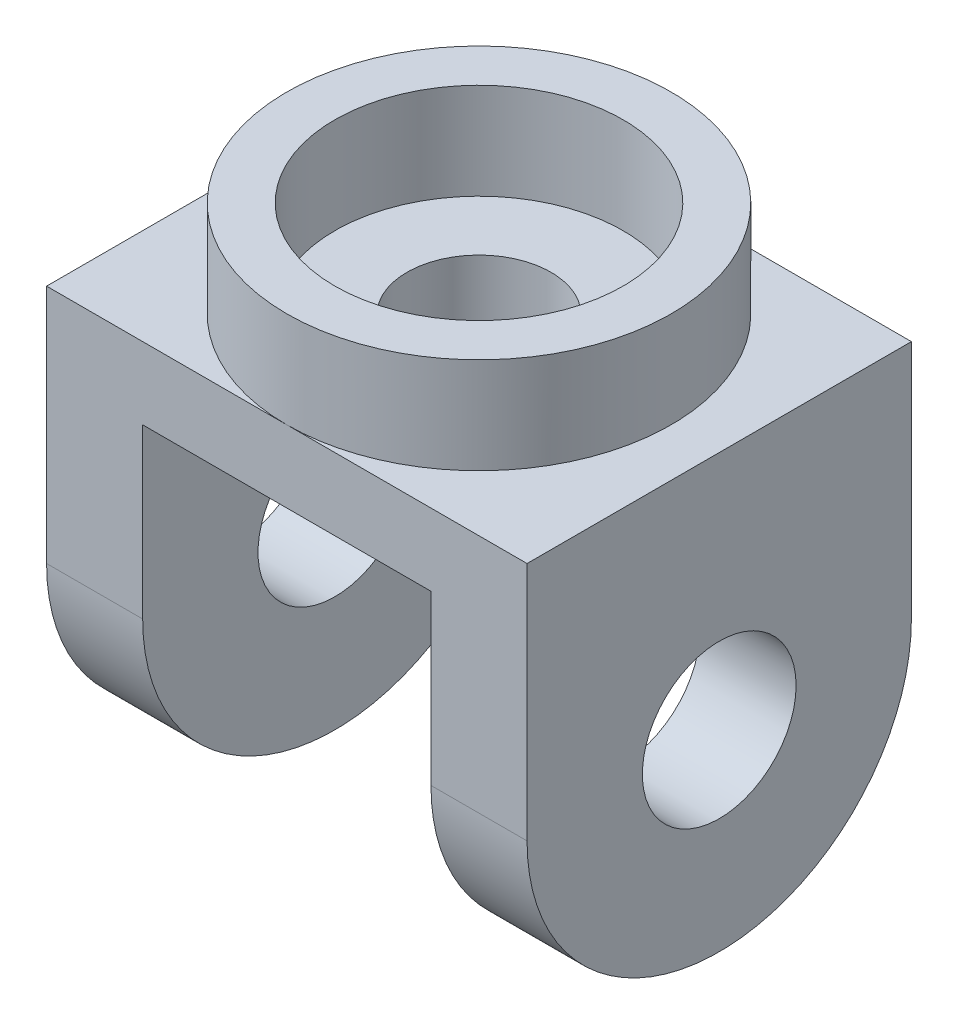
ISO-10303-21;
HEADER;
FILE_DESCRIPTION(('STEP AP214'),'2;1');
FILE_NAME('part.step','',(''),(''),'','','');
FILE_SCHEMA(('AUTOMOTIVE_DESIGN { 1 0 10303 214 1 1 1 1 }'));
ENDSEC;
DATA;
#1=APPLICATION_CONTEXT('core data for automotive mechanical design processes');
#2=APPLICATION_PROTOCOL_DEFINITION('international standard','automotive_design',2000,#1);
#3=PRODUCT_CONTEXT('',#1,'mechanical');
#4=PRODUCT('Part','Part','',(#3));
#5=PRODUCT_RELATED_PRODUCT_CATEGORY('part','',(#4));
#6=PRODUCT_DEFINITION_FORMATION('','',#4);
#7=PRODUCT_DEFINITION_CONTEXT('part definition',#1,'design');
#8=PRODUCT_DEFINITION('design','',#6,#7);
#9=PRODUCT_DEFINITION_SHAPE('','',#8);
#10=(LENGTH_UNIT() NAMED_UNIT(*) SI_UNIT(.MILLI.,.METRE.));
#11=(NAMED_UNIT(*) PLANE_ANGLE_UNIT() SI_UNIT($,.RADIAN.));
#12=(NAMED_UNIT(*) SI_UNIT($,.STERADIAN.) SOLID_ANGLE_UNIT());
#13=UNCERTAINTY_MEASURE_WITH_UNIT(LENGTH_MEASURE(1.E-05),#10,'distance_accuracy_value','');
#14=(GEOMETRIC_REPRESENTATION_CONTEXT(3) GLOBAL_UNCERTAINTY_ASSIGNED_CONTEXT((#13)) GLOBAL_UNIT_ASSIGNED_CONTEXT((#10,
#11,#12)) REPRESENTATION_CONTEXT('',''));
#15=CARTESIAN_POINT('',(0.,0.,0.));
#16=DIRECTION('',(0.,0.,1.));
#17=DIRECTION('',(1.,0.,0.));
#18=AXIS2_PLACEMENT_3D('',#15,#16,#17);
#19=CARTESIAN_POINT('',(-50.,25.,-80.));
#20=DIRECTION('',(0.,1.,0.));
#21=DIRECTION('',(0.,0.,1.));
#22=AXIS2_PLACEMENT_3D('',#19,#20,#21);
#23=PLANE('',#22);
#24=CARTESIAN_POINT('',(0.,25.,-40.));
#25=DIRECTION('',(0.,1.,0.));
#26=DIRECTION('',(0.,0.,1.));
#27=AXIS2_PLACEMENT_3D('',#24,#25,#26);
#28=CIRCLE('',#27,40.);
#29=CARTESIAN_POINT('',(0.,25.,0.));
#30=VERTEX_POINT('',#29);
#31=CARTESIAN_POINT('',(0.,25.,-80.));
#32=VERTEX_POINT('',#31);
#33=EDGE_CURVE('E44',#30,#32,#28,.T.);
#34=ORIENTED_EDGE('',*,*,#33,.F.);
#35=DIRECTION('',(-1.,0.,0.));
#36=VECTOR('',#35,1.);
#37=CARTESIAN_POINT('',(-50.,25.,0.));
#38=LINE('',#37,#36);
#39=CARTESIAN_POINT('',(50.,25.,0.));
#40=VERTEX_POINT('',#39);
#41=EDGE_CURVE('E114',#40,#30,#38,.T.);
#42=ORIENTED_EDGE('',*,*,#41,.F.);
#43=DIRECTION('',(0.,0.,1.));
#44=VECTOR('',#43,1.);
#45=CARTESIAN_POINT('',(50.,25.,-80.));
#46=LINE('',#45,#44);
#47=CARTESIAN_POINT('',(50.,25.,-80.));
#48=VERTEX_POINT('',#47);
#49=EDGE_CURVE('E92',#48,#40,#46,.T.);
#50=ORIENTED_EDGE('',*,*,#49,.F.);
#51=DIRECTION('',(-1.,0.,0.));
#52=VECTOR('',#51,1.);
#53=CARTESIAN_POINT('',(-50.,25.,-80.));
#54=LINE('',#53,#52);
#55=EDGE_CURVE('E129',#48,#32,#54,.T.);
#56=ORIENTED_EDGE('',*,*,#55,.T.);
#57=EDGE_LOOP('',(#34,#42,#50,#56));
#58=FACE_BOUND('',#57,.T.);
#59=ADVANCED_FACE('F33',(#58),#23,.T.);
#60=CARTESIAN_POINT('',(50.,-25.,-80.));
#61=DIRECTION('',(1.,0.,0.));
#62=DIRECTION('',(0.,0.,-1.));
#63=AXIS2_PLACEMENT_3D('',#60,#61,#62);
#64=PLANE('',#63);
#65=CARTESIAN_POINT('',(50.,-25.,-40.));
#66=DIRECTION('',(1.,0.,0.));
#67=DIRECTION('',(0.,0.,-1.));
#68=AXIS2_PLACEMENT_3D('',#65,#66,#67);
#69=CIRCLE('',#68,16.);
#70=CARTESIAN_POINT('',(50.,-25.,-56.));
#71=VERTEX_POINT('',#70);
#72=EDGE_CURVE('E217',#71,#71,#69,.T.);
#73=ORIENTED_EDGE('',*,*,#72,.F.);
#74=EDGE_LOOP('',(#73));
#75=FACE_BOUND('',#74,.T.);
#76=DIRECTION('',(0.,1.,0.));
#77=VECTOR('',#76,1.);
#78=CARTESIAN_POINT('',(50.,-25.,0.));
#79=LINE('',#78,#77);
#80=CARTESIAN_POINT('',(50.,-25.,0.));
#81=VERTEX_POINT('',#80);
#82=EDGE_CURVE('E120',#81,#40,#79,.T.);
#83=ORIENTED_EDGE('',*,*,#82,.F.);
#84=CARTESIAN_POINT('',(50.,-25.,-40.));
#85=DIRECTION('',(1.,0.,0.));
#86=DIRECTION('',(0.,0.,-1.));
#87=AXIS2_PLACEMENT_3D('',#84,#85,#86);
#88=CIRCLE('',#87,40.);
#89=CARTESIAN_POINT('',(50.,-25.,-80.));
#90=VERTEX_POINT('',#89);
#91=EDGE_CURVE('E85',#81,#90,#88,.T.);
#92=ORIENTED_EDGE('',*,*,#91,.T.);
#93=DIRECTION('',(0.,1.,0.));
#94=VECTOR('',#93,1.);
#95=CARTESIAN_POINT('',(50.,-25.,-80.));
#96=LINE('',#95,#94);
#97=EDGE_CURVE('E227',#90,#48,#96,.T.);
#98=ORIENTED_EDGE('',*,*,#97,.T.);
#99=ORIENTED_EDGE('',*,*,#49,.T.);
#100=EDGE_LOOP('',(#83,#92,#98,#99));
#101=FACE_BOUND('',#100,.T.);
#102=ADVANCED_FACE('F35',(#75,#101),#64,.T.);
#103=CARTESIAN_POINT('',(30.,-25.,-80.));
#104=DIRECTION('',(-1.,0.,0.));
#105=DIRECTION('',(0.,-1.,0.));
#106=AXIS2_PLACEMENT_3D('',#103,#104,#105);
#107=PLANE('',#106);
#108=CARTESIAN_POINT('',(30.,-25.,-40.));
#109=DIRECTION('',(1.,0.,0.));
#110=DIRECTION('',(0.,0.,-1.));
#111=AXIS2_PLACEMENT_3D('',#108,#109,#110);
#112=CIRCLE('',#111,16.);
#113=CARTESIAN_POINT('',(30.,-25.,-56.));
#114=VERTEX_POINT('',#113);
#115=EDGE_CURVE('E219',#114,#114,#112,.T.);
#116=ORIENTED_EDGE('',*,*,#115,.T.);
#117=EDGE_LOOP('',(#116));
#118=FACE_BOUND('',#117,.T.);
#119=DIRECTION('',(0.,-1.,0.));
#120=VECTOR('',#119,1.);
#121=CARTESIAN_POINT('',(30.,-25.,0.));
#122=LINE('',#121,#120);
#123=CARTESIAN_POINT('',(30.,10.,0.));
#124=VERTEX_POINT('',#123);
#125=CARTESIAN_POINT('',(30.,-25.,0.));
#126=VERTEX_POINT('',#125);
#127=EDGE_CURVE('E260',#124,#126,#122,.T.);
#128=ORIENTED_EDGE('',*,*,#127,.F.);
#129=DIRECTION('',(0.,0.,1.));
#130=VECTOR('',#129,1.);
#131=CARTESIAN_POINT('',(30.,10.,-80.));
#132=LINE('',#131,#130);
#133=CARTESIAN_POINT('',(30.,10.,-80.));
#134=VERTEX_POINT('',#133);
#135=EDGE_CURVE('E42',#134,#124,#132,.T.);
#136=ORIENTED_EDGE('',*,*,#135,.F.);
#137=DIRECTION('',(0.,-1.,0.));
#138=VECTOR('',#137,1.);
#139=CARTESIAN_POINT('',(30.,-25.,-80.));
#140=LINE('',#139,#138);
#141=CARTESIAN_POINT('',(30.,-25.,-80.));
#142=VERTEX_POINT('',#141);
#143=EDGE_CURVE('E245',#134,#142,#140,.T.);
#144=ORIENTED_EDGE('',*,*,#143,.T.);
#145=CARTESIAN_POINT('',(30.,-25.,-40.));
#146=DIRECTION('',(1.,0.,0.));
#147=DIRECTION('',(0.,0.,-1.));
#148=AXIS2_PLACEMENT_3D('',#145,#146,#147);
#149=CIRCLE('',#148,40.);
#150=EDGE_CURVE('E224',#126,#142,#149,.T.);
#151=ORIENTED_EDGE('',*,*,#150,.F.);
#152=EDGE_LOOP('',(#128,#136,#144,#151));
#153=FACE_BOUND('',#152,.T.);
#154=ADVANCED_FACE('F155',(#118,#153),#107,.T.);
#155=CARTESIAN_POINT('',(-30.,10.,-80.));
#156=DIRECTION('',(0.,-1.,0.));
#157=DIRECTION('',(0.,0.,-1.));
#158=AXIS2_PLACEMENT_3D('',#155,#156,#157);
#159=PLANE('',#158);
#160=CARTESIAN_POINT('',(0.,10.,-40.));
#161=DIRECTION('',(0.,-1.,0.));
#162=DIRECTION('',(0.,0.,-1.));
#163=AXIS2_PLACEMENT_3D('',#160,#161,#162);
#164=CIRCLE('',#163,15.);
#165=CARTESIAN_POINT('',(0.,10.,-25.));
#166=VERTEX_POINT('',#165);
#167=EDGE_CURVE('E37',#166,#166,#164,.T.);
#168=ORIENTED_EDGE('',*,*,#167,.F.);
#169=EDGE_LOOP('',(#168));
#170=FACE_BOUND('',#169,.T.);
#171=DIRECTION('',(1.,0.,0.));
#172=VECTOR('',#171,1.);
#173=CARTESIAN_POINT('',(-30.,10.,0.));
#174=LINE('',#173,#172);
#175=CARTESIAN_POINT('',(-30.,10.,0.));
#176=VERTEX_POINT('',#175);
#177=EDGE_CURVE('E257',#176,#124,#174,.T.);
#178=ORIENTED_EDGE('',*,*,#177,.F.);
#179=DIRECTION('',(0.,0.,1.));
#180=VECTOR('',#179,1.);
#181=CARTESIAN_POINT('',(-30.,10.,-80.));
#182=LINE('',#181,#180);
#183=CARTESIAN_POINT('',(-30.,10.,-80.));
#184=VERTEX_POINT('',#183);
#185=EDGE_CURVE('E265',#184,#176,#182,.T.);
#186=ORIENTED_EDGE('',*,*,#185,.F.);
#187=DIRECTION('',(1.,0.,0.));
#188=VECTOR('',#187,1.);
#189=CARTESIAN_POINT('',(-30.,10.,-80.));
#190=LINE('',#189,#188);
#191=EDGE_CURVE('E242',#184,#134,#190,.T.);
#192=ORIENTED_EDGE('',*,*,#191,.T.);
#193=ORIENTED_EDGE('',*,*,#135,.T.);
#194=EDGE_LOOP('',(#178,#186,#192,#193));
#195=FACE_BOUND('',#194,.T.);
#196=ADVANCED_FACE('F175',(#170,#195),#159,.T.);
#197=CARTESIAN_POINT('',(-30.,-25.,-80.));
#198=DIRECTION('',(1.,0.,0.));
#199=DIRECTION('',(0.,0.,-1.));
#200=AXIS2_PLACEMENT_3D('',#197,#198,#199);
#201=PLANE('',#200);
#202=CARTESIAN_POINT('',(-30.,-25.,-40.));
#203=DIRECTION('',(1.,0.,0.));
#204=DIRECTION('',(0.,0.,-1.));
#205=AXIS2_PLACEMENT_3D('',#202,#203,#204);
#206=CIRCLE('',#205,16.);
#207=CARTESIAN_POINT('',(-30.,-25.,-56.));
#208=VERTEX_POINT('',#207);
#209=EDGE_CURVE('E206',#208,#208,#206,.T.);
#210=ORIENTED_EDGE('',*,*,#209,.F.);
#211=EDGE_LOOP('',(#210));
#212=FACE_BOUND('',#211,.T.);
#213=DIRECTION('',(0.,1.,0.));
#214=VECTOR('',#213,1.);
#215=CARTESIAN_POINT('',(-30.,-25.,0.));
#216=LINE('',#215,#214);
#217=CARTESIAN_POINT('',(-30.,-25.,0.));
#218=VERTEX_POINT('',#217);
#219=EDGE_CURVE('E254',#218,#176,#216,.T.);
#220=ORIENTED_EDGE('',*,*,#219,.F.);
#221=CARTESIAN_POINT('',(-30.,-25.,-40.));
#222=DIRECTION('',(1.,0.,0.));
#223=DIRECTION('',(0.,0.,-1.));
#224=AXIS2_PLACEMENT_3D('',#221,#222,#223);
#225=CIRCLE('',#224,40.);
#226=CARTESIAN_POINT('',(-30.,-25.,-80.));
#227=VERTEX_POINT('',#226);
#228=EDGE_CURVE('E215',#218,#227,#225,.T.);
#229=ORIENTED_EDGE('',*,*,#228,.T.);
#230=DIRECTION('',(0.,1.,0.));
#231=VECTOR('',#230,1.);
#232=CARTESIAN_POINT('',(-30.,-25.,-80.));
#233=LINE('',#232,#231);
#234=EDGE_CURVE('E239',#227,#184,#233,.T.);
#235=ORIENTED_EDGE('',*,*,#234,.T.);
#236=ORIENTED_EDGE('',*,*,#185,.T.);
#237=EDGE_LOOP('',(#220,#229,#235,#236));
#238=FACE_BOUND('',#237,.T.);
#239=ADVANCED_FACE('F170',(#212,#238),#201,.T.);
#240=CARTESIAN_POINT('',(-50.,-25.,-80.));
#241=DIRECTION('',(-1.,0.,0.));
#242=DIRECTION('',(0.,0.,1.));
#243=AXIS2_PLACEMENT_3D('',#240,#241,#242);
#244=PLANE('',#243);
#245=CARTESIAN_POINT('',(-50.,-25.,-40.));
#246=DIRECTION('',(1.,0.,0.));
#247=DIRECTION('',(0.,0.,-1.));
#248=AXIS2_PLACEMENT_3D('',#245,#246,#247);
#249=CIRCLE('',#248,16.);
#250=CARTESIAN_POINT('',(-50.,-25.,-56.));
#251=VERTEX_POINT('',#250);
#252=EDGE_CURVE('E208',#251,#251,#249,.T.);
#253=ORIENTED_EDGE('',*,*,#252,.T.);
#254=EDGE_LOOP('',(#253));
#255=FACE_BOUND('',#254,.T.);
#256=DIRECTION('',(0.,-1.,0.));
#257=VECTOR('',#256,1.);
#258=CARTESIAN_POINT('',(-50.,-25.,0.));
#259=LINE('',#258,#257);
#260=CARTESIAN_POINT('',(-50.,25.,0.));
#261=VERTEX_POINT('',#260);
#262=CARTESIAN_POINT('',(-50.,-25.,0.));
#263=VERTEX_POINT('',#262);
#264=EDGE_CURVE('E122',#261,#263,#259,.T.);
#265=ORIENTED_EDGE('',*,*,#264,.F.);
#266=DIRECTION('',(0.,0.,1.));
#267=VECTOR('',#266,1.);
#268=CARTESIAN_POINT('',(-50.,25.,-80.));
#269=LINE('',#268,#267);
#270=CARTESIAN_POINT('',(-50.,25.,-80.));
#271=VERTEX_POINT('',#270);
#272=EDGE_CURVE('E126',#271,#261,#269,.T.);
#273=ORIENTED_EDGE('',*,*,#272,.F.);
#274=DIRECTION('',(0.,-1.,0.));
#275=VECTOR('',#274,1.);
#276=CARTESIAN_POINT('',(-50.,-25.,-80.));
#277=LINE('',#276,#275);
#278=CARTESIAN_POINT('',(-50.,-25.,-80.));
#279=VERTEX_POINT('',#278);
#280=EDGE_CURVE('E233',#271,#279,#277,.T.);
#281=ORIENTED_EDGE('',*,*,#280,.T.);
#282=CARTESIAN_POINT('',(-50.,-25.,-40.));
#283=DIRECTION('',(1.,0.,0.));
#284=DIRECTION('',(0.,0.,-1.));
#285=AXIS2_PLACEMENT_3D('',#282,#283,#284);
#286=CIRCLE('',#285,40.);
#287=EDGE_CURVE('E210',#263,#279,#286,.T.);
#288=ORIENTED_EDGE('',*,*,#287,.F.);
#289=EDGE_LOOP('',(#265,#273,#281,#288));
#290=FACE_BOUND('',#289,.T.);
#291=ADVANCED_FACE('F163',(#255,#290),#244,.T.);
#292=EDGE_CURVE('E11',#32,#30,#28,.T.);
#293=ORIENTED_EDGE('',*,*,#292,.F.);
#294=EDGE_CURVE('E230',#32,#271,#54,.T.);
#295=ORIENTED_EDGE('',*,*,#294,.T.);
#296=ORIENTED_EDGE('',*,*,#272,.T.);
#297=EDGE_CURVE('E117',#30,#261,#38,.T.);
#298=ORIENTED_EDGE('',*,*,#297,.F.);
#299=EDGE_LOOP('',(#293,#295,#296,#298));
#300=FACE_BOUND('',#299,.T.);
#301=ADVANCED_FACE('F124',(#300),#23,.T.);
#302=CARTESIAN_POINT('',(0.,0.,-80.));
#303=DIRECTION('',(0.,0.,-1.));
#304=DIRECTION('',(-1.,0.,0.));
#305=AXIS2_PLACEMENT_3D('',#302,#303,#304);
#306=PLANE('',#305);
#307=ORIENTED_EDGE('',*,*,#97,.F.);
#308=DIRECTION('',(1.,0.,0.));
#309=VECTOR('',#308,1.);
#310=CARTESIAN_POINT('',(30.,-25.,-80.));
#311=LINE('',#310,#309);
#312=EDGE_CURVE('E247',#142,#90,#311,.T.);
#313=ORIENTED_EDGE('',*,*,#312,.F.);
#314=ORIENTED_EDGE('',*,*,#143,.F.);
#315=ORIENTED_EDGE('',*,*,#191,.F.);
#316=ORIENTED_EDGE('',*,*,#234,.F.);
#317=DIRECTION('',(1.,0.,0.));
#318=VECTOR('',#317,1.);
#319=CARTESIAN_POINT('',(-50.,-25.,-80.));
#320=LINE('',#319,#318);
#321=EDGE_CURVE('E236',#279,#227,#320,.T.);
#322=ORIENTED_EDGE('',*,*,#321,.F.);
#323=ORIENTED_EDGE('',*,*,#280,.F.);
#324=ORIENTED_EDGE('',*,*,#294,.F.);
#325=ORIENTED_EDGE('',*,*,#55,.F.);
#326=EDGE_LOOP('',(#307,#313,#314,#315,#316,#322,#323,#324,#325));
#327=FACE_BOUND('',#326,.T.);
#328=ADVANCED_FACE('F162',(#327),#306,.T.);
#329=CARTESIAN_POINT('',(0.,0.,0.));
#330=DIRECTION('',(0.,0.,-1.));
#331=DIRECTION('',(-1.,0.,0.));
#332=AXIS2_PLACEMENT_3D('',#329,#330,#331);
#333=PLANE('',#332);
#334=ORIENTED_EDGE('',*,*,#82,.T.);
#335=ORIENTED_EDGE('',*,*,#41,.T.);
#336=ORIENTED_EDGE('',*,*,#297,.T.);
#337=ORIENTED_EDGE('',*,*,#264,.T.);
#338=DIRECTION('',(1.,0.,0.));
#339=VECTOR('',#338,1.);
#340=CARTESIAN_POINT('',(-50.,-25.,0.));
#341=LINE('',#340,#339);
#342=EDGE_CURVE('E251',#263,#218,#341,.T.);
#343=ORIENTED_EDGE('',*,*,#342,.T.);
#344=ORIENTED_EDGE('',*,*,#219,.T.);
#345=ORIENTED_EDGE('',*,*,#177,.T.);
#346=ORIENTED_EDGE('',*,*,#127,.T.);
#347=DIRECTION('',(1.,0.,0.));
#348=VECTOR('',#347,1.);
#349=CARTESIAN_POINT('',(30.,-25.,0.));
#350=LINE('',#349,#348);
#351=EDGE_CURVE('E231',#126,#81,#350,.T.);
#352=ORIENTED_EDGE('',*,*,#351,.T.);
#353=EDGE_LOOP('',(#334,#335,#336,#337,#343,#344,#345,#346,#352));
#354=FACE_BOUND('',#353,.T.);
#355=ADVANCED_FACE('F115',(#354),#333,.F.);
#356=CARTESIAN_POINT('',(30.,-25.,-40.));
#357=DIRECTION('',(1.,0.,0.));
#358=DIRECTION('',(0.,0.,-1.));
#359=AXIS2_PLACEMENT_3D('',#356,#357,#358);
#360=CYLINDRICAL_SURFACE('',#359,40.);
#361=ORIENTED_EDGE('',*,*,#91,.F.);
#362=ORIENTED_EDGE('',*,*,#351,.F.);
#363=ORIENTED_EDGE('',*,*,#150,.T.);
#364=ORIENTED_EDGE('',*,*,#312,.T.);
#365=EDGE_LOOP('',(#361,#362,#363,#364));
#366=FACE_BOUND('',#365,.T.);
#367=ADVANCED_FACE('F188',(#366),#360,.T.);
#368=CARTESIAN_POINT('',(30.,-25.,-40.));
#369=DIRECTION('',(1.,0.,0.));
#370=DIRECTION('',(0.,0.,-1.));
#371=AXIS2_PLACEMENT_3D('',#368,#369,#370);
#372=CYLINDRICAL_SURFACE('',#371,16.);
#373=ORIENTED_EDGE('',*,*,#115,.F.);
#374=EDGE_LOOP('',(#373));
#375=FACE_BOUND('',#374,.T.);
#376=ORIENTED_EDGE('',*,*,#72,.T.);
#377=EDGE_LOOP('',(#376));
#378=FACE_BOUND('',#377,.T.);
#379=ADVANCED_FACE('F192',(#375,#378),#372,.F.);
#380=CARTESIAN_POINT('',(-30.,-25.,-40.));
#381=DIRECTION('',(-1.,0.,0.));
#382=DIRECTION('',(0.,0.,1.));
#383=AXIS2_PLACEMENT_3D('',#380,#381,#382);
#384=CYLINDRICAL_SURFACE('',#383,40.);
#385=ORIENTED_EDGE('',*,*,#287,.T.);
#386=ORIENTED_EDGE('',*,*,#321,.T.);
#387=ORIENTED_EDGE('',*,*,#228,.F.);
#388=ORIENTED_EDGE('',*,*,#342,.F.);
#389=EDGE_LOOP('',(#385,#386,#387,#388));
#390=FACE_BOUND('',#389,.T.);
#391=ADVANCED_FACE('F195',(#390),#384,.T.);
#392=CARTESIAN_POINT('',(-30.,-25.,-40.));
#393=DIRECTION('',(-1.,0.,0.));
#394=DIRECTION('',(0.,0.,1.));
#395=AXIS2_PLACEMENT_3D('',#392,#393,#394);
#396=CYLINDRICAL_SURFACE('',#395,16.);
#397=ORIENTED_EDGE('',*,*,#209,.T.);
#398=EDGE_LOOP('',(#397));
#399=FACE_BOUND('',#398,.T.);
#400=ORIENTED_EDGE('',*,*,#252,.F.);
#401=EDGE_LOOP('',(#400));
#402=FACE_BOUND('',#401,.T.);
#403=ADVANCED_FACE('F146',(#399,#402),#396,.F.);
#404=CARTESIAN_POINT('',(0.,45.,-40.));
#405=DIRECTION('',(0.,1.,0.));
#406=DIRECTION('',(0.,0.,1.));
#407=AXIS2_PLACEMENT_3D('',#404,#405,#406);
#408=PLANE('',#407);
#409=CARTESIAN_POINT('',(0.,45.,-40.));
#410=DIRECTION('',(0.,1.,0.));
#411=DIRECTION('',(0.,0.,1.));
#412=AXIS2_PLACEMENT_3D('',#409,#410,#411);
#413=CIRCLE('',#412,40.);
#414=CARTESIAN_POINT('',(0.,45.,0.));
#415=VERTEX_POINT('',#414);
#416=EDGE_CURVE('E131',#415,#415,#413,.T.);
#417=ORIENTED_EDGE('',*,*,#416,.T.);
#418=EDGE_LOOP('',(#417));
#419=FACE_BOUND('',#418,.T.);
#420=CARTESIAN_POINT('',(0.,45.,-40.));
#421=DIRECTION('',(0.,1.,0.));
#422=DIRECTION('',(0.,0.,1.));
#423=AXIS2_PLACEMENT_3D('',#420,#421,#422);
#424=CIRCLE('',#423,30.);
#425=CARTESIAN_POINT('',(0.,45.,-10.));
#426=VERTEX_POINT('',#425);
#427=EDGE_CURVE('E132',#426,#426,#424,.T.);
#428=ORIENTED_EDGE('',*,*,#427,.F.);
#429=EDGE_LOOP('',(#428));
#430=FACE_BOUND('',#429,.T.);
#431=ADVANCED_FACE('F136',(#419,#430),#408,.T.);
#432=CARTESIAN_POINT('',(0.,45.,-40.));
#433=DIRECTION('',(0.,-1.,0.));
#434=DIRECTION('',(0.,0.,-1.));
#435=AXIS2_PLACEMENT_3D('',#432,#433,#434);
#436=CYLINDRICAL_SURFACE('',#435,40.);
#437=ORIENTED_EDGE('',*,*,#416,.F.);
#438=EDGE_LOOP('',(#437));
#439=FACE_BOUND('',#438,.T.);
#440=ORIENTED_EDGE('',*,*,#33,.T.);
#441=ORIENTED_EDGE('',*,*,#292,.T.);
#442=EDGE_LOOP('',(#440,#441));
#443=FACE_BOUND('',#442,.T.);
#444=ADVANCED_FACE('F133',(#439,#443),#436,.T.);
#445=CARTESIAN_POINT('',(0.,45.,-40.));
#446=DIRECTION('',(0.,-1.,0.));
#447=DIRECTION('',(0.,0.,-1.));
#448=AXIS2_PLACEMENT_3D('',#445,#446,#447);
#449=CYLINDRICAL_SURFACE('',#448,30.);
#450=ORIENTED_EDGE('',*,*,#427,.T.);
#451=EDGE_LOOP('',(#450));
#452=FACE_BOUND('',#451,.T.);
#453=CARTESIAN_POINT('',(0.,25.,-40.));
#454=DIRECTION('',(0.,1.,0.));
#455=DIRECTION('',(0.,0.,1.));
#456=AXIS2_PLACEMENT_3D('',#453,#454,#455);
#457=CIRCLE('',#456,30.);
#458=CARTESIAN_POINT('',(0.,25.,-10.));
#459=VERTEX_POINT('',#458);
#460=EDGE_CURVE('E284',#459,#459,#457,.T.);
#461=ORIENTED_EDGE('',*,*,#460,.F.);
#462=EDGE_LOOP('',(#461));
#463=FACE_BOUND('',#462,.T.);
#464=ADVANCED_FACE('F135',(#452,#463),#449,.F.);
#465=CARTESIAN_POINT('',(0.,25.,-40.));
#466=DIRECTION('',(0.,1.,0.));
#467=DIRECTION('',(0.,0.,1.));
#468=AXIS2_PLACEMENT_3D('',#465,#466,#467);
#469=CIRCLE('',#468,15.);
#470=CARTESIAN_POINT('',(0.,25.,-25.));
#471=VERTEX_POINT('',#470);
#472=EDGE_CURVE('E289',#471,#471,#469,.T.);
#473=ORIENTED_EDGE('',*,*,#472,.F.);
#474=EDGE_LOOP('',(#473));
#475=FACE_BOUND('',#474,.T.);
#476=ORIENTED_EDGE('',*,*,#460,.T.);
#477=EDGE_LOOP('',(#476));
#478=FACE_BOUND('',#477,.T.);
#479=ADVANCED_FACE('F143',(#475,#478),#23,.T.);
#480=CARTESIAN_POINT('',(0.,-65.,-40.));
#481=DIRECTION('',(0.,1.,0.));
#482=DIRECTION('',(0.,0.,1.));
#483=AXIS2_PLACEMENT_3D('',#480,#481,#482);
#484=CYLINDRICAL_SURFACE('',#483,15.);
#485=CARTESIAN_POINT('',(0.,10.,-25.));
#486=CARTESIAN_POINT('',(0.,10.15625,-25.));
#487=CARTESIAN_POINT('',(0.,10.3125,-25.));
#488=CARTESIAN_POINT('',(0.,10.625,-25.));
#489=CARTESIAN_POINT('',(0.,10.78125,-25.));
#490=CARTESIAN_POINT('',(0.,11.09375,-25.));
#491=CARTESIAN_POINT('',(0.,11.25,-25.));
#492=CARTESIAN_POINT('',(0.,11.5625,-25.));
#493=CARTESIAN_POINT('',(0.,11.71875,-25.));
#494=CARTESIAN_POINT('',(0.,12.03125,-25.));
#495=CARTESIAN_POINT('',(0.,12.1875,-25.));
#496=CARTESIAN_POINT('',(0.,12.5,-25.));
#497=CARTESIAN_POINT('',(0.,12.65625,-25.));
#498=CARTESIAN_POINT('',(0.,12.96875,-25.));
#499=CARTESIAN_POINT('',(0.,13.125,-25.));
#500=CARTESIAN_POINT('',(0.,13.4375,-25.));
#501=CARTESIAN_POINT('',(0.,13.59375,-25.));
#502=CARTESIAN_POINT('',(0.,13.90625,-25.));
#503=CARTESIAN_POINT('',(0.,14.0625,-25.));
#504=CARTESIAN_POINT('',(0.,14.375,-25.));
#505=CARTESIAN_POINT('',(0.,14.53125,-25.));
#506=CARTESIAN_POINT('',(0.,14.84375,-25.));
#507=CARTESIAN_POINT('',(0.,15.,-25.));
#508=CARTESIAN_POINT('',(0.,15.3125,-25.));
#509=CARTESIAN_POINT('',(0.,15.46875,-25.));
#510=CARTESIAN_POINT('',(0.,15.78125,-25.));
#511=CARTESIAN_POINT('',(0.,15.9375,-25.));
#512=CARTESIAN_POINT('',(0.,16.25,-25.));
#513=CARTESIAN_POINT('',(0.,16.40625,-25.));
#514=CARTESIAN_POINT('',(0.,16.71875,-25.));
#515=CARTESIAN_POINT('',(0.,16.875,-25.));
#516=CARTESIAN_POINT('',(0.,17.1875,-25.));
#517=CARTESIAN_POINT('',(0.,17.34375,-25.));
#518=CARTESIAN_POINT('',(0.,17.65625,-25.));
#519=CARTESIAN_POINT('',(0.,17.8125,-25.));
#520=CARTESIAN_POINT('',(0.,18.125,-25.));
#521=CARTESIAN_POINT('',(0.,18.28125,-25.));
#522=CARTESIAN_POINT('',(0.,18.59375,-25.));
#523=CARTESIAN_POINT('',(0.,18.75,-25.));
#524=CARTESIAN_POINT('',(0.,19.0625,-25.));
#525=CARTESIAN_POINT('',(0.,19.21875,-25.));
#526=CARTESIAN_POINT('',(0.,19.53125,-25.));
#527=CARTESIAN_POINT('',(0.,19.6875,-25.));
#528=CARTESIAN_POINT('',(0.,20.,-25.));
#529=CARTESIAN_POINT('',(0.,20.15625,-25.));
#530=CARTESIAN_POINT('',(0.,20.46875,-25.));
#531=CARTESIAN_POINT('',(0.,20.625,-25.));
#532=CARTESIAN_POINT('',(0.,20.9375,-25.));
#533=CARTESIAN_POINT('',(0.,21.09375,-25.));
#534=CARTESIAN_POINT('',(0.,21.40625,-25.));
#535=CARTESIAN_POINT('',(0.,21.5625,-25.));
#536=CARTESIAN_POINT('',(0.,21.875,-25.));
#537=CARTESIAN_POINT('',(0.,22.03125,-25.));
#538=CARTESIAN_POINT('',(0.,22.34375,-25.));
#539=CARTESIAN_POINT('',(0.,22.5,-25.));
#540=CARTESIAN_POINT('',(0.,22.8125,-25.));
#541=CARTESIAN_POINT('',(0.,22.96875,-25.));
#542=CARTESIAN_POINT('',(0.,23.28125,-25.));
#543=CARTESIAN_POINT('',(0.,23.4375,-25.));
#544=CARTESIAN_POINT('',(0.,23.75,-25.));
#545=CARTESIAN_POINT('',(0.,23.90625,-25.));
#546=CARTESIAN_POINT('',(0.,24.21875,-25.));
#547=CARTESIAN_POINT('',(0.,24.375,-25.));
#548=CARTESIAN_POINT('',(0.,24.6875,-25.));
#549=CARTESIAN_POINT('',(0.,24.84375,-25.));
#550=CARTESIAN_POINT('',(0.,25.,-25.));
#551=B_SPLINE_CURVE_WITH_KNOTS('',3,(#485,#486,#487,#488,#489,#490,#491,#492,#493,#494,#495,
#496,#497,#498,#499,#500,#501,#502,#503,#504,#505,#506,#507,#508,#509,#510,#511,#512,#513,#514,
#515,#516,#517,#518,#519,#520,#521,#522,#523,#524,#525,#526,#527,#528,#529,#530,#531,#532,#533,
#534,#535,#536,#537,#538,#539,#540,#541,#542,#543,#544,#545,#546,#547,#548,#549,#550),
.UNSPECIFIED.,.F.,.F.,(4,2,2,2,2,2,2,2,2,2,2,2,2,2,2,2,2,2,2,2,2,2,2,2,2,2,2,2,2,2,2,2,4),(0.,
0.468750000000004,0.937499999999994,1.40625,1.875,2.34374999999999,2.8125,3.28125,3.75,
4.21874999999999,4.6875,5.15625,5.62499999999999,6.09374999999999,6.5625,7.03124999999999,
7.49999999999999,7.96875,8.43749999999999,8.90624999999999,9.37499999999999,9.84374999999998,
10.3125,10.78125,11.25,11.71875,12.1875,12.65625,13.125,13.59375,14.0625,14.53125,15.),.UNSPECIFIED.);
#552=EDGE_CURVE('BSEAM159',#166,#471,#551,.T.);
#553=ORIENTED_EDGE('',*,*,#167,.T.);
#554=ORIENTED_EDGE('',*,*,#472,.T.);
#555=ORIENTED_EDGE('',*,*,#552,.T.);
#556=ORIENTED_EDGE('',*,*,#552,.F.);
#557=EDGE_LOOP('',(#553,#555,#554,#556));
#558=FACE_BOUND('',#557,.T.);
#559=ADVANCED_FACE('F159',(#558),#484,.F.);
#560=CLOSED_SHELL('',(#59,#102,#154,#196,#239,#291,#301,#328,#355,#367,#379,#391,#403,#431,#444,
#464,#479,#559));
#561=MANIFOLD_SOLID_BREP('B2',#560);
#562=ADVANCED_BREP_SHAPE_REPRESENTATION('',(#18,#561),#14);
#563=SHAPE_DEFINITION_REPRESENTATION(#9,#562);
ENDSEC;
END-ISO-10303-21;
